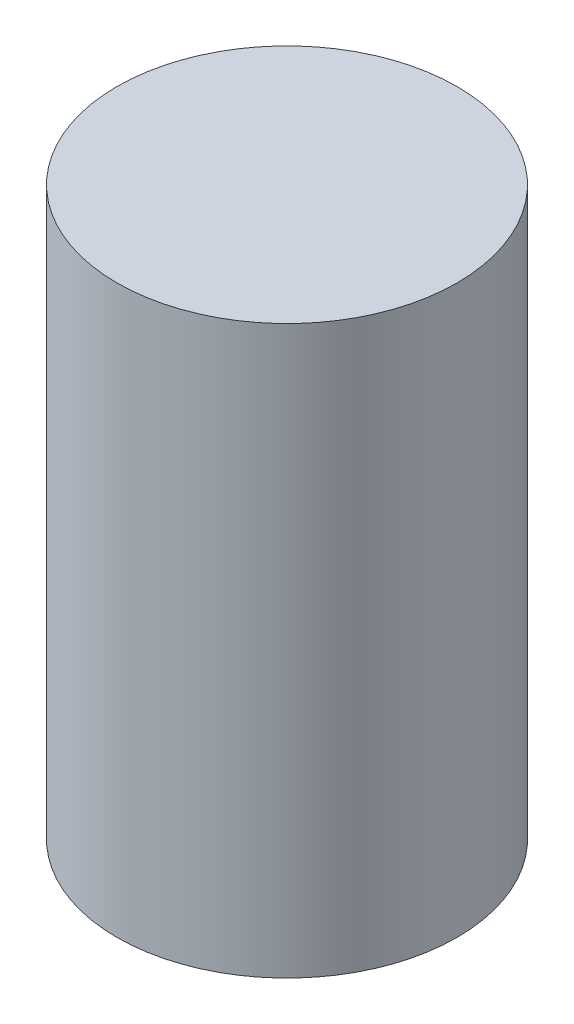
ISO-10303-21;
HEADER;
FILE_DESCRIPTION(('STEP AP214'),'2;1');
FILE_NAME('part.step','',(''),(''),'','','');
FILE_SCHEMA(('AUTOMOTIVE_DESIGN { 1 0 10303 214 1 1 1 1 }'));
ENDSEC;
DATA;
#1=APPLICATION_CONTEXT('core data for automotive mechanical design processes');
#2=APPLICATION_PROTOCOL_DEFINITION('international standard','automotive_design',2000,#1);
#3=PRODUCT_CONTEXT('',#1,'mechanical');
#4=PRODUCT('Part','Part','',(#3));
#5=PRODUCT_RELATED_PRODUCT_CATEGORY('part','',(#4));
#6=PRODUCT_DEFINITION_FORMATION('','',#4);
#7=PRODUCT_DEFINITION_CONTEXT('part definition',#1,'design');
#8=PRODUCT_DEFINITION('design','',#6,#7);
#9=PRODUCT_DEFINITION_SHAPE('','',#8);
#10=(LENGTH_UNIT() NAMED_UNIT(*) SI_UNIT(.MILLI.,.METRE.));
#11=(NAMED_UNIT(*) PLANE_ANGLE_UNIT() SI_UNIT($,.RADIAN.));
#12=(NAMED_UNIT(*) SI_UNIT($,.STERADIAN.) SOLID_ANGLE_UNIT());
#13=UNCERTAINTY_MEASURE_WITH_UNIT(LENGTH_MEASURE(1.E-05),#10,'distance_accuracy_value','');
#14=(GEOMETRIC_REPRESENTATION_CONTEXT(3) GLOBAL_UNCERTAINTY_ASSIGNED_CONTEXT((#13)) GLOBAL_UNIT_ASSIGNED_CONTEXT((#10,
#11,#12)) REPRESENTATION_CONTEXT('',''));
#15=CARTESIAN_POINT('',(0.,0.,0.));
#16=DIRECTION('',(0.,0.,1.));
#17=DIRECTION('',(1.,0.,0.));
#18=AXIS2_PLACEMENT_3D('',#15,#16,#17);
#19=CARTESIAN_POINT('',(0.,100.,0.));
#20=DIRECTION('',(0.,-1.,0.));
#21=DIRECTION('',(0.,0.,-1.));
#22=AXIS2_PLACEMENT_3D('',#19,#20,#21);
#23=CYLINDRICAL_SURFACE('',#22,30.);
#24=CARTESIAN_POINT('',(0.,100.,0.));
#25=DIRECTION('',(0.,1.,0.));
#26=DIRECTION('',(0.,0.,1.));
#27=AXIS2_PLACEMENT_3D('',#24,#25,#26);
#28=CIRCLE('',#27,30.);
#29=CARTESIAN_POINT('',(0.,100.,30.));
#30=VERTEX_POINT('',#29);
#31=EDGE_CURVE('E10',#30,#30,#28,.T.);
#32=ORIENTED_EDGE('',*,*,#31,.F.);
#33=EDGE_LOOP('',(#32));
#34=FACE_BOUND('',#33,.T.);
#35=CARTESIAN_POINT('',(0.,0.,0.));
#36=DIRECTION('',(0.,1.,0.));
#37=DIRECTION('',(0.,0.,1.));
#38=AXIS2_PLACEMENT_3D('',#35,#36,#37);
#39=CIRCLE('',#38,30.);
#40=CARTESIAN_POINT('',(0.,0.,30.));
#41=VERTEX_POINT('',#40);
#42=EDGE_CURVE('E38',#41,#41,#39,.T.);
#43=ORIENTED_EDGE('',*,*,#42,.T.);
#44=EDGE_LOOP('',(#43));
#45=FACE_BOUND('',#44,.T.);
#46=ADVANCED_FACE('F35',(#34,#45),#23,.T.);
#47=CARTESIAN_POINT('',(0.,100.,0.));
#48=DIRECTION('',(0.,1.,0.));
#49=DIRECTION('',(0.,0.,1.));
#50=AXIS2_PLACEMENT_3D('',#47,#48,#49);
#51=PLANE('',#50);
#52=ORIENTED_EDGE('',*,*,#31,.T.);
#53=EDGE_LOOP('',(#52));
#54=FACE_BOUND('',#53,.T.);
#55=ADVANCED_FACE('F50',(#54),#51,.T.);
#56=CARTESIAN_POINT('',(0.,0.,0.));
#57=DIRECTION('',(0.,1.,0.));
#58=DIRECTION('',(0.,0.,1.));
#59=AXIS2_PLACEMENT_3D('',#56,#57,#58);
#60=PLANE('',#59);
#61=ORIENTED_EDGE('',*,*,#42,.F.);
#62=EDGE_LOOP('',(#61));
#63=FACE_BOUND('',#62,.T.);
#64=ADVANCED_FACE('F48',(#63),#60,.F.);
#65=CLOSED_SHELL('',(#46,#55,#64));
#66=MANIFOLD_SOLID_BREP('B2',#65);
#67=ADVANCED_BREP_SHAPE_REPRESENTATION('',(#18,#66),#14);
#68=SHAPE_DEFINITION_REPRESENTATION(#9,#67);
ENDSEC;
END-ISO-10303-21;
